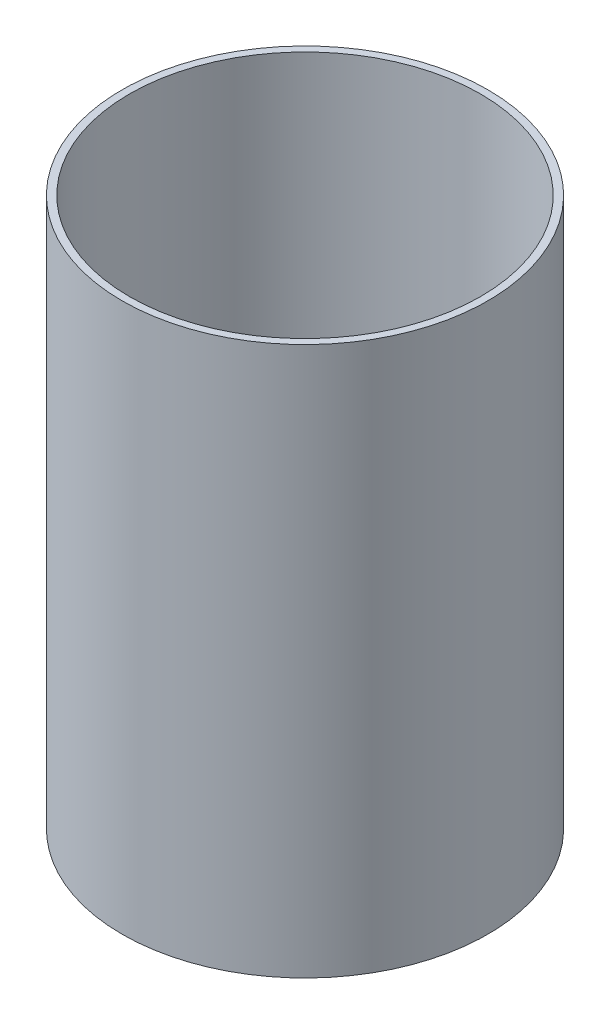
ISO-10303-21;
HEADER;
FILE_DESCRIPTION(('STEP AP214'),'2;1');
FILE_NAME('part.step','',(''),(''),'','','');
FILE_SCHEMA(('AUTOMOTIVE_DESIGN { 1 0 10303 214 1 1 1 1 }'));
ENDSEC;
DATA;
#1=APPLICATION_CONTEXT('core data for automotive mechanical design processes');
#2=APPLICATION_PROTOCOL_DEFINITION('international standard','automotive_design',2000,#1);
#3=PRODUCT_CONTEXT('',#1,'mechanical');
#4=PRODUCT('Part','Part','',(#3));
#5=PRODUCT_RELATED_PRODUCT_CATEGORY('part','',(#4));
#6=PRODUCT_DEFINITION_FORMATION('','',#4);
#7=PRODUCT_DEFINITION_CONTEXT('part definition',#1,'design');
#8=PRODUCT_DEFINITION('design','',#6,#7);
#9=PRODUCT_DEFINITION_SHAPE('','',#8);
#10=(LENGTH_UNIT() NAMED_UNIT(*) SI_UNIT(.MILLI.,.METRE.));
#11=(NAMED_UNIT(*) PLANE_ANGLE_UNIT() SI_UNIT($,.RADIAN.));
#12=(NAMED_UNIT(*) SI_UNIT($,.STERADIAN.) SOLID_ANGLE_UNIT());
#13=UNCERTAINTY_MEASURE_WITH_UNIT(LENGTH_MEASURE(1.E-05),#10,'distance_accuracy_value','');
#14=(GEOMETRIC_REPRESENTATION_CONTEXT(3) GLOBAL_UNCERTAINTY_ASSIGNED_CONTEXT((#13)) GLOBAL_UNIT_ASSIGNED_CONTEXT((#10,
#11,#12)) REPRESENTATION_CONTEXT('',''));
#15=CARTESIAN_POINT('',(0.,0.,0.));
#16=DIRECTION('',(0.,0.,1.));
#17=DIRECTION('',(1.,0.,0.));
#18=AXIS2_PLACEMENT_3D('',#15,#16,#17);
#19=CARTESIAN_POINT('',(0.,150.,0.));
#20=DIRECTION('',(0.,1.,0.));
#21=DIRECTION('',(0.,0.,1.));
#22=AXIS2_PLACEMENT_3D('',#19,#20,#21);
#23=PLANE('',#22);
#24=CARTESIAN_POINT('',(0.,150.,0.));
#25=DIRECTION('',(0.,1.,0.));
#26=DIRECTION('',(0.,0.,1.));
#27=AXIS2_PLACEMENT_3D('',#24,#25,#26);
#28=CIRCLE('',#27,50.);
#29=CARTESIAN_POINT('',(0.,150.,50.));
#30=VERTEX_POINT('',#29);
#31=EDGE_CURVE('E10',#30,#30,#28,.T.);
#32=ORIENTED_EDGE('',*,*,#31,.T.);
#33=EDGE_LOOP('',(#32));
#34=FACE_BOUND('',#33,.T.);
#35=CARTESIAN_POINT('',(0.,150.,0.));
#36=DIRECTION('',(0.,1.,0.));
#37=DIRECTION('',(0.,0.,1.));
#38=AXIS2_PLACEMENT_3D('',#35,#36,#37);
#39=CIRCLE('',#38,48.);
#40=CARTESIAN_POINT('',(0.,150.,48.));
#41=VERTEX_POINT('',#40);
#42=EDGE_CURVE('E47',#41,#41,#39,.T.);
#43=ORIENTED_EDGE('',*,*,#42,.F.);
#44=EDGE_LOOP('',(#43));
#45=FACE_BOUND('',#44,.T.);
#46=ADVANCED_FACE('F36',(#34,#45),#23,.T.);
#47=CARTESIAN_POINT('',(0.,0.,0.));
#48=DIRECTION('',(0.,1.,0.));
#49=DIRECTION('',(0.,0.,1.));
#50=AXIS2_PLACEMENT_3D('',#47,#48,#49);
#51=PLANE('',#50);
#52=CARTESIAN_POINT('',(0.,0.,0.));
#53=DIRECTION('',(0.,1.,0.));
#54=DIRECTION('',(0.,0.,1.));
#55=AXIS2_PLACEMENT_3D('',#52,#53,#54);
#56=CIRCLE('',#55,50.);
#57=CARTESIAN_POINT('',(0.,0.,50.));
#58=VERTEX_POINT('',#57);
#59=EDGE_CURVE('E40',#58,#58,#56,.T.);
#60=ORIENTED_EDGE('',*,*,#59,.F.);
#61=EDGE_LOOP('',(#60));
#62=FACE_BOUND('',#61,.T.);
#63=CARTESIAN_POINT('',(0.,0.,0.));
#64=DIRECTION('',(0.,1.,0.));
#65=DIRECTION('',(0.,0.,1.));
#66=AXIS2_PLACEMENT_3D('',#63,#64,#65);
#67=CIRCLE('',#66,48.);
#68=CARTESIAN_POINT('',(0.,0.,48.));
#69=VERTEX_POINT('',#68);
#70=EDGE_CURVE('E49',#69,#69,#67,.T.);
#71=ORIENTED_EDGE('',*,*,#70,.T.);
#72=EDGE_LOOP('',(#71));
#73=FACE_BOUND('',#72,.T.);
#74=ADVANCED_FACE('F59',(#62,#73),#51,.F.);
#75=CARTESIAN_POINT('',(0.,150.,0.));
#76=DIRECTION('',(0.,-1.,0.));
#77=DIRECTION('',(0.,0.,-1.));
#78=AXIS2_PLACEMENT_3D('',#75,#76,#77);
#79=CYLINDRICAL_SURFACE('',#78,50.);
#80=ORIENTED_EDGE('',*,*,#31,.F.);
#81=EDGE_LOOP('',(#80));
#82=FACE_BOUND('',#81,.T.);
#83=ORIENTED_EDGE('',*,*,#59,.T.);
#84=EDGE_LOOP('',(#83));
#85=FACE_BOUND('',#84,.T.);
#86=ADVANCED_FACE('F38',(#82,#85),#79,.T.);
#87=CARTESIAN_POINT('',(0.,150.,0.));
#88=DIRECTION('',(0.,-1.,0.));
#89=DIRECTION('',(0.,0.,-1.));
#90=AXIS2_PLACEMENT_3D('',#87,#88,#89);
#91=CYLINDRICAL_SURFACE('',#90,48.);
#92=ORIENTED_EDGE('',*,*,#42,.T.);
#93=EDGE_LOOP('',(#92));
#94=FACE_BOUND('',#93,.T.);
#95=ORIENTED_EDGE('',*,*,#70,.F.);
#96=EDGE_LOOP('',(#95));
#97=FACE_BOUND('',#96,.T.);
#98=ADVANCED_FACE('F55',(#94,#97),#91,.F.);
#99=CLOSED_SHELL('',(#46,#74,#86,#98));
#100=MANIFOLD_SOLID_BREP('B2',#99);
#101=ADVANCED_BREP_SHAPE_REPRESENTATION('',(#18,#100),#14);
#102=SHAPE_DEFINITION_REPRESENTATION(#9,#101);
ENDSEC;
END-ISO-10303-21;
